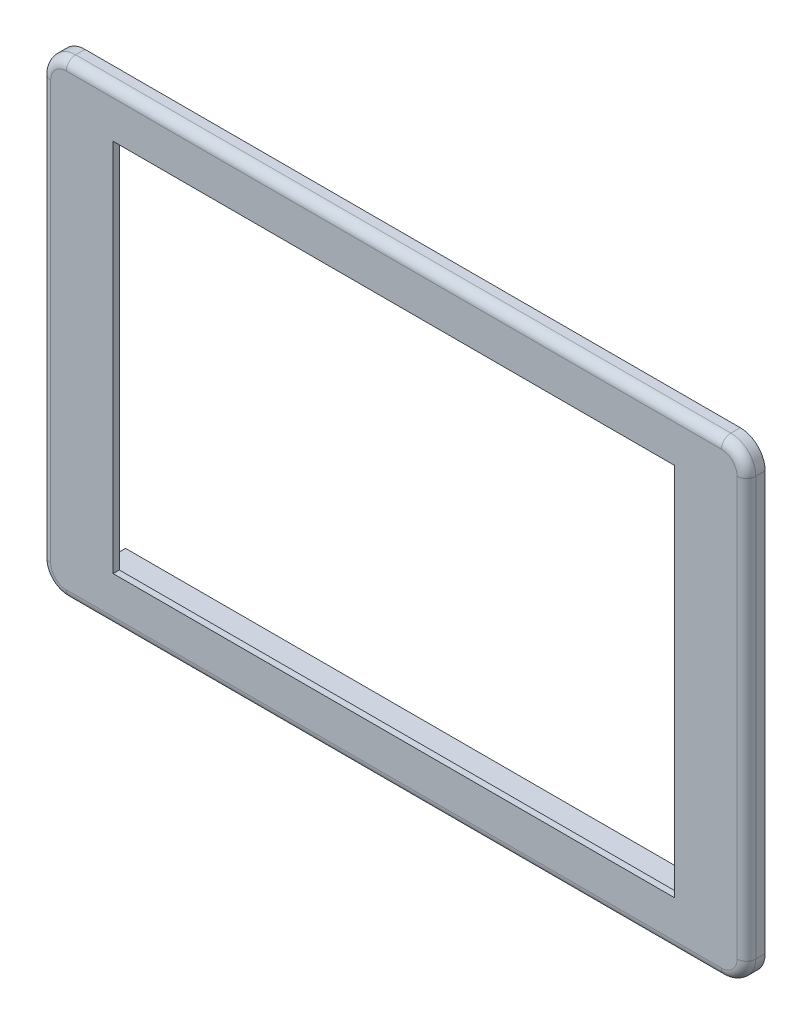
ISO-10303-21;
HEADER;
FILE_DESCRIPTION(('STEP AP214'),'2;1');
FILE_NAME('part.step','',(''),(''),'','','');
FILE_SCHEMA(('AUTOMOTIVE_DESIGN { 1 0 10303 214 1 1 1 1 }'));
ENDSEC;
DATA;
#1=APPLICATION_CONTEXT('core data for automotive mechanical design processes');
#2=APPLICATION_PROTOCOL_DEFINITION('international standard','automotive_design',2000,#1);
#3=PRODUCT_CONTEXT('',#1,'mechanical');
#4=PRODUCT('Part','Part','',(#3));
#5=PRODUCT_RELATED_PRODUCT_CATEGORY('part','',(#4));
#6=PRODUCT_DEFINITION_FORMATION('','',#4);
#7=PRODUCT_DEFINITION_CONTEXT('part definition',#1,'design');
#8=PRODUCT_DEFINITION('design','',#6,#7);
#9=PRODUCT_DEFINITION_SHAPE('','',#8);
#10=(LENGTH_UNIT() NAMED_UNIT(*) SI_UNIT(.MILLI.,.METRE.));
#11=(NAMED_UNIT(*) PLANE_ANGLE_UNIT() SI_UNIT($,.RADIAN.));
#12=(NAMED_UNIT(*) SI_UNIT($,.STERADIAN.) SOLID_ANGLE_UNIT());
#13=UNCERTAINTY_MEASURE_WITH_UNIT(LENGTH_MEASURE(1.E-05),#10,'distance_accuracy_value','');
#14=(GEOMETRIC_REPRESENTATION_CONTEXT(3) GLOBAL_UNCERTAINTY_ASSIGNED_CONTEXT((#13)) GLOBAL_UNIT_ASSIGNED_CONTEXT((#10,
#11,#12)) REPRESENTATION_CONTEXT('',''));
#15=CARTESIAN_POINT('',(0.,0.,0.));
#16=DIRECTION('',(0.,0.,1.));
#17=DIRECTION('',(1.,0.,0.));
#18=AXIS2_PLACEMENT_3D('',#15,#16,#17);
#19=CARTESIAN_POINT('',(-75.0209507435224,34.8430782656183,3.));
#20=DIRECTION('',(1.,0.,0.));
#21=DIRECTION('',(0.,1.,0.));
#22=AXIS2_PLACEMENT_3D('',#19,#20,#21);
#23=PLANE('',#22);
#24=DIRECTION('',(0.,0.,-1.));
#25=VECTOR('',#24,1.);
#26=CARTESIAN_POINT('',(-75.0209507435224,34.8430782656183,3.));
#27=LINE('',#26,#25);
#28=CARTESIAN_POINT('',(-75.0209507435224,34.8430782656183,2.));
#29=VERTEX_POINT('',#28);
#30=CARTESIAN_POINT('',(-75.0209507435224,34.8430782656183,0.));
#31=VERTEX_POINT('',#30);
#32=EDGE_CURVE('E256',#29,#31,#27,.T.);
#33=ORIENTED_EDGE('',*,*,#32,.F.);
#34=DIRECTION('',(0.,-1.,0.));
#35=VECTOR('',#34,1.);
#36=CARTESIAN_POINT('',(-75.0209507435224,34.8430782656183,2.));
#37=LINE('',#36,#35);
#38=CARTESIAN_POINT('',(-75.0209507435224,-28.1569217343817,2.));
#39=VERTEX_POINT('',#38);
#40=EDGE_CURVE('E63',#29,#39,#37,.T.);
#41=ORIENTED_EDGE('',*,*,#40,.T.);
#42=DIRECTION('',(0.,0.,-1.));
#43=VECTOR('',#42,1.);
#44=CARTESIAN_POINT('',(-75.0209507435224,-28.1569217343817,3.));
#45=LINE('',#44,#43);
#46=CARTESIAN_POINT('',(-75.0209507435224,-28.1569217343817,0.));
#47=VERTEX_POINT('',#46);
#48=EDGE_CURVE('E265',#39,#47,#45,.T.);
#49=ORIENTED_EDGE('',*,*,#48,.T.);
#50=DIRECTION('',(0.,-1.,0.));
#51=VECTOR('',#50,1.);
#52=CARTESIAN_POINT('',(-75.0209507435224,34.8430782656183,0.));
#53=LINE('',#52,#51);
#54=EDGE_CURVE('E242',#31,#47,#53,.T.);
#55=ORIENTED_EDGE('',*,*,#54,.F.);
#56=EDGE_LOOP('',(#33,#41,#49,#55));
#57=FACE_BOUND('',#56,.T.);
#58=ADVANCED_FACE('F45',(#57),#23,.T.);
#59=CARTESIAN_POINT('',(-75.0209507435224,-28.1569217343817,3.));
#60=DIRECTION('',(0.,1.,0.));
#61=DIRECTION('',(0.,0.,1.));
#62=AXIS2_PLACEMENT_3D('',#59,#60,#61);
#63=PLANE('',#62);
#64=ORIENTED_EDGE('',*,*,#48,.F.);
#65=DIRECTION('',(1.,0.,0.));
#66=VECTOR('',#65,1.);
#67=CARTESIAN_POINT('',(-75.0209507435224,-28.1569217343817,2.));
#68=LINE('',#67,#66);
#69=CARTESIAN_POINT('',(22.9790492564776,-28.1569217343817,2.));
#70=VERTEX_POINT('',#69);
#71=EDGE_CURVE('E486',#39,#70,#68,.T.);
#72=ORIENTED_EDGE('',*,*,#71,.T.);
#73=DIRECTION('',(0.,0.,-1.));
#74=VECTOR('',#73,1.);
#75=CARTESIAN_POINT('',(22.9790492564776,-28.1569217343817,3.));
#76=LINE('',#75,#74);
#77=CARTESIAN_POINT('',(22.9790492564776,-28.1569217343817,0.));
#78=VERTEX_POINT('',#77);
#79=EDGE_CURVE('E262',#70,#78,#76,.T.);
#80=ORIENTED_EDGE('',*,*,#79,.T.);
#81=DIRECTION('',(0.,0.,1.));
#82=VECTOR('',#81,1.);
#83=CARTESIAN_POINT('',(22.9790492564776,-28.1569217343817,-3.));
#84=LINE('',#83,#82);
#85=CARTESIAN_POINT('',(22.9790492564776,-28.1569217343817,-3.));
#86=VERTEX_POINT('',#85);
#87=EDGE_CURVE('E424',#86,#78,#84,.T.);
#88=ORIENTED_EDGE('',*,*,#87,.F.);
#89=DIRECTION('',(1.,0.,0.));
#90=VECTOR('',#89,1.);
#91=CARTESIAN_POINT('',(22.9790492564776,-28.1569217343817,-3.));
#92=LINE('',#91,#90);
#93=CARTESIAN_POINT('',(-75.0209507435224,-28.1569217343817,-3.));
#94=VERTEX_POINT('',#93);
#95=EDGE_CURVE('E428',#94,#86,#92,.T.);
#96=ORIENTED_EDGE('',*,*,#95,.F.);
#97=DIRECTION('',(0.,0.,1.));
#98=VECTOR('',#97,1.);
#99=CARTESIAN_POINT('',(-75.0209507435224,-28.1569217343817,-3.));
#100=LINE('',#99,#98);
#101=EDGE_CURVE('E416',#94,#47,#100,.T.);
#102=ORIENTED_EDGE('',*,*,#101,.T.);
#103=EDGE_LOOP('',(#64,#72,#80,#88,#96,#102));
#104=FACE_BOUND('',#103,.T.);
#105=ADVANCED_FACE('F509',(#104),#63,.T.);
#106=CARTESIAN_POINT('',(22.9790492564776,34.8430782656183,3.));
#107=DIRECTION('',(-1.,0.,0.));
#108=DIRECTION('',(0.,-1.,0.));
#109=AXIS2_PLACEMENT_3D('',#106,#107,#108);
#110=PLANE('',#109);
#111=ORIENTED_EDGE('',*,*,#79,.F.);
#112=DIRECTION('',(0.,1.,0.));
#113=VECTOR('',#112,1.);
#114=CARTESIAN_POINT('',(22.9790492564776,34.8430782656183,2.));
#115=LINE('',#114,#113);
#116=CARTESIAN_POINT('',(22.9790492564776,34.8430782656183,2.));
#117=VERTEX_POINT('',#116);
#118=EDGE_CURVE('E489',#70,#117,#115,.T.);
#119=ORIENTED_EDGE('',*,*,#118,.T.);
#120=DIRECTION('',(0.,0.,-1.));
#121=VECTOR('',#120,1.);
#122=CARTESIAN_POINT('',(22.9790492564776,34.8430782656183,3.));
#123=LINE('',#122,#121);
#124=CARTESIAN_POINT('',(22.9790492564776,34.8430782656183,0.));
#125=VERTEX_POINT('',#124);
#126=EDGE_CURVE('E259',#117,#125,#123,.T.);
#127=ORIENTED_EDGE('',*,*,#126,.T.);
#128=DIRECTION('',(0.,1.,0.));
#129=VECTOR('',#128,1.);
#130=CARTESIAN_POINT('',(22.9790492564776,34.8430782656183,0.));
#131=LINE('',#130,#129);
#132=EDGE_CURVE('E247',#78,#125,#131,.T.);
#133=ORIENTED_EDGE('',*,*,#132,.F.);
#134=EDGE_LOOP('',(#111,#119,#127,#133));
#135=FACE_BOUND('',#134,.T.);
#136=ADVANCED_FACE('F533',(#135),#110,.T.);
#137=CARTESIAN_POINT('',(-75.0209507435224,34.8430782656183,3.));
#138=DIRECTION('',(0.,-1.,0.));
#139=DIRECTION('',(0.,0.,-1.));
#140=AXIS2_PLACEMENT_3D('',#137,#138,#139);
#141=PLANE('',#140);
#142=DIRECTION('',(-1.,0.,0.));
#143=VECTOR('',#142,1.);
#144=CARTESIAN_POINT('',(30.4790492564776,34.8430782656183,-2.49999999999996));
#145=LINE('',#144,#143);
#146=CARTESIAN_POINT('',(22.9790492564776,34.8430782656183,-2.49999999999996));
#147=VERTEX_POINT('',#146);
#148=CARTESIAN_POINT('',(-75.0209507435224,34.8430782656183,-2.49999999999996));
#149=VERTEX_POINT('',#148);
#150=EDGE_CURVE('E217',#147,#149,#145,.T.);
#151=ORIENTED_EDGE('',*,*,#150,.F.);
#152=DIRECTION('',(0.,0.,1.));
#153=VECTOR('',#152,1.);
#154=CARTESIAN_POINT('',(22.9790492564776,34.8430782656183,-3.));
#155=LINE('',#154,#153);
#156=EDGE_CURVE('E233',#147,#125,#155,.T.);
#157=ORIENTED_EDGE('',*,*,#156,.T.);
#158=ORIENTED_EDGE('',*,*,#126,.F.);
#159=DIRECTION('',(-1.,0.,0.));
#160=VECTOR('',#159,1.);
#161=CARTESIAN_POINT('',(-75.0209507435224,34.8430782656183,2.));
#162=LINE('',#161,#160);
#163=EDGE_CURVE('E372',#117,#29,#162,.T.);
#164=ORIENTED_EDGE('',*,*,#163,.T.);
#165=ORIENTED_EDGE('',*,*,#32,.T.);
#166=DIRECTION('',(0.,0.,1.));
#167=VECTOR('',#166,1.);
#168=CARTESIAN_POINT('',(-75.0209507435224,34.8430782656183,-3.));
#169=LINE('',#168,#167);
#170=EDGE_CURVE('E236',#149,#31,#169,.T.);
#171=ORIENTED_EDGE('',*,*,#170,.F.);
#172=EDGE_LOOP('',(#151,#157,#158,#164,#165,#171));
#173=FACE_BOUND('',#172,.T.);
#174=ADVANCED_FACE('F231',(#173),#141,.T.);
#175=CARTESIAN_POINT('',(0.,0.,0.));
#176=DIRECTION('',(0.,0.,1.));
#177=DIRECTION('',(1.,0.,0.));
#178=AXIS2_PLACEMENT_3D('',#175,#176,#177);
#179=PLANE('',#178);
#180=DIRECTION('',(1.,0.,0.));
#181=VECTOR('',#180,1.);
#182=CARTESIAN_POINT('',(22.9790492564776,37.3430782656183,0.));
#183=LINE('',#182,#181);
#184=CARTESIAN_POINT('',(-75.0209507435224,37.3430782656183,0.));
#185=VERTEX_POINT('',#184);
#186=CARTESIAN_POINT('',(22.9790492564776,37.3430782656183,0.));
#187=VERTEX_POINT('',#186);
#188=EDGE_CURVE('E220',#185,#187,#183,.T.);
#189=ORIENTED_EDGE('',*,*,#188,.F.);
#190=DIRECTION('',(0.,1.,0.));
#191=VECTOR('',#190,1.);
#192=CARTESIAN_POINT('',(-75.0209507435224,34.8430782656183,0.));
#193=LINE('',#192,#191);
#194=EDGE_CURVE('E452',#31,#185,#193,.T.);
#195=ORIENTED_EDGE('',*,*,#194,.F.);
#196=ORIENTED_EDGE('',*,*,#54,.T.);
#197=DIRECTION('',(0.,1.,0.));
#198=VECTOR('',#197,1.);
#199=CARTESIAN_POINT('',(-75.0209507435224,-28.1569217343817,0.));
#200=LINE('',#199,#198);
#201=CARTESIAN_POINT('',(-75.0209507435224,-30.6569217343817,0.));
#202=VERTEX_POINT('',#201);
#203=EDGE_CURVE('E429',#202,#47,#200,.T.);
#204=ORIENTED_EDGE('',*,*,#203,.F.);
#205=DIRECTION('',(-1.,0.,0.));
#206=VECTOR('',#205,1.);
#207=CARTESIAN_POINT('',(22.9790492564776,-30.6569217343817,0.));
#208=LINE('',#207,#206);
#209=CARTESIAN_POINT('',(22.9790492564776,-30.6569217343817,0.));
#210=VERTEX_POINT('',#209);
#211=EDGE_CURVE('E433',#210,#202,#208,.T.);
#212=ORIENTED_EDGE('',*,*,#211,.F.);
#213=DIRECTION('',(0.,-1.,0.));
#214=VECTOR('',#213,1.);
#215=CARTESIAN_POINT('',(22.9790492564776,-28.1569217343817,0.));
#216=LINE('',#215,#214);
#217=EDGE_CURVE('E437',#78,#210,#216,.T.);
#218=ORIENTED_EDGE('',*,*,#217,.F.);
#219=ORIENTED_EDGE('',*,*,#132,.T.);
#220=DIRECTION('',(0.,-1.,0.));
#221=VECTOR('',#220,1.);
#222=CARTESIAN_POINT('',(22.9790492564776,34.8430782656183,0.));
#223=LINE('',#222,#221);
#224=EDGE_CURVE('E240',#187,#125,#223,.T.);
#225=ORIENTED_EDGE('',*,*,#224,.F.);
#226=EDGE_LOOP('',(#189,#195,#196,#204,#212,#218,#219,#225));
#227=FACE_BOUND('',#226,.T.);
#228=CARTESIAN_POINT('',(-78.5209507435224,36.8430782656183,0.));
#229=DIRECTION('',(0.,0.,1.));
#230=DIRECTION('',(1.,0.,0.));
#231=AXIS2_PLACEMENT_3D('',#228,#229,#230);
#232=CIRCLE('',#231,4.);
#233=CARTESIAN_POINT('',(-82.5209507435224,36.8430782656183,0.));
#234=VERTEX_POINT('',#233);
#235=CARTESIAN_POINT('',(-78.5209507435224,40.8430782656183,0.));
#236=VERTEX_POINT('',#235);
#237=EDGE_CURVE('E300',#234,#236,#232,.F.);
#238=ORIENTED_EDGE('',*,*,#237,.T.);
#239=DIRECTION('',(-1.,0.,0.));
#240=VECTOR('',#239,1.);
#241=CARTESIAN_POINT('',(-82.5209507435224,40.8430782656183,0.));
#242=LINE('',#241,#240);
#243=CARTESIAN_POINT('',(26.4790492564776,40.8430782656183,0.));
#244=VERTEX_POINT('',#243);
#245=EDGE_CURVE('E280',#244,#236,#242,.T.);
#246=ORIENTED_EDGE('',*,*,#245,.F.);
#247=CARTESIAN_POINT('',(26.4790492564776,36.8430782656183,0.));
#248=DIRECTION('',(0.,0.,1.));
#249=DIRECTION('',(1.,0.,0.));
#250=AXIS2_PLACEMENT_3D('',#247,#248,#249);
#251=CIRCLE('',#250,4.);
#252=CARTESIAN_POINT('',(30.4790492564775,36.8430782656183,0.));
#253=VERTEX_POINT('',#252);
#254=EDGE_CURVE('E291',#244,#253,#251,.F.);
#255=ORIENTED_EDGE('',*,*,#254,.T.);
#256=DIRECTION('',(0.,1.,0.));
#257=VECTOR('',#256,1.);
#258=CARTESIAN_POINT('',(30.4790492564775,40.8430782656183,0.));
#259=LINE('',#258,#257);
#260=CARTESIAN_POINT('',(30.4790492564776,-30.1569217343817,0.));
#261=VERTEX_POINT('',#260);
#262=EDGE_CURVE('E276',#261,#253,#259,.T.);
#263=ORIENTED_EDGE('',*,*,#262,.F.);
#264=CARTESIAN_POINT('',(26.4790492564776,-30.1569217343817,0.));
#265=DIRECTION('',(0.,0.,1.));
#266=DIRECTION('',(1.,0.,0.));
#267=AXIS2_PLACEMENT_3D('',#264,#265,#266);
#268=CIRCLE('',#267,4.);
#269=CARTESIAN_POINT('',(26.4790492564776,-34.1569217343817,0.));
#270=VERTEX_POINT('',#269);
#271=EDGE_CURVE('E294',#261,#270,#268,.F.);
#272=ORIENTED_EDGE('',*,*,#271,.T.);
#273=DIRECTION('',(1.,0.,0.));
#274=VECTOR('',#273,1.);
#275=CARTESIAN_POINT('',(-82.5209507435224,-34.1569217343817,0.));
#276=LINE('',#275,#274);
#277=CARTESIAN_POINT('',(-78.5209507435224,-34.1569217343817,0.));
#278=VERTEX_POINT('',#277);
#279=EDGE_CURVE('E272',#278,#270,#276,.T.);
#280=ORIENTED_EDGE('',*,*,#279,.F.);
#281=CARTESIAN_POINT('',(-78.5209507435224,-30.1569217343817,0.));
#282=DIRECTION('',(0.,0.,1.));
#283=DIRECTION('',(1.,0.,0.));
#284=AXIS2_PLACEMENT_3D('',#281,#282,#283);
#285=CIRCLE('',#284,4.);
#286=CARTESIAN_POINT('',(-82.5209507435224,-30.1569217343817,0.));
#287=VERTEX_POINT('',#286);
#288=EDGE_CURVE('E297',#278,#287,#285,.F.);
#289=ORIENTED_EDGE('',*,*,#288,.T.);
#290=DIRECTION('',(0.,-1.,0.));
#291=VECTOR('',#290,1.);
#292=CARTESIAN_POINT('',(-82.5209507435224,40.8430782656183,0.));
#293=LINE('',#292,#291);
#294=EDGE_CURVE('E268',#234,#287,#293,.T.);
#295=ORIENTED_EDGE('',*,*,#294,.F.);
#296=EDGE_LOOP('',(#238,#246,#255,#263,#272,#280,#289,#295));
#297=FACE_BOUND('',#296,.T.);
#298=ADVANCED_FACE('F500',(#227,#297),#179,.F.);
#299=CARTESIAN_POINT('',(0.,0.,3.));
#300=DIRECTION('',(0.,0.,1.));
#301=DIRECTION('',(1.,0.,0.));
#302=AXIS2_PLACEMENT_3D('',#299,#300,#301);
#303=PLANE('',#302);
#304=CARTESIAN_POINT('',(26.4790492564776,36.8430782656183,3.));
#305=DIRECTION('',(0.,0.,1.));
#306=DIRECTION('',(1.,0.,0.));
#307=AXIS2_PLACEMENT_3D('',#304,#305,#306);
#308=CIRCLE('',#307,2.5);
#309=CARTESIAN_POINT('',(28.9790492564776,36.8430782656183,3.));
#310=VERTEX_POINT('',#309);
#311=CARTESIAN_POINT('',(26.4790492564776,39.3430782656183,3.));
#312=VERTEX_POINT('',#311);
#313=EDGE_CURVE('E339',#310,#312,#308,.T.);
#314=ORIENTED_EDGE('',*,*,#313,.T.);
#315=DIRECTION('',(-1.,0.,0.));
#316=VECTOR('',#315,1.);
#317=CARTESIAN_POINT('',(-78.5209507435224,39.3430782656183,3.));
#318=LINE('',#317,#316);
#319=CARTESIAN_POINT('',(-78.5209507435224,39.3430782656183,3.));
#320=VERTEX_POINT('',#319);
#321=EDGE_CURVE('E345',#312,#320,#318,.T.);
#322=ORIENTED_EDGE('',*,*,#321,.T.);
#323=CARTESIAN_POINT('',(-78.5209507435224,36.8430782656183,3.));
#324=DIRECTION('',(0.,0.,1.));
#325=DIRECTION('',(1.,0.,0.));
#326=AXIS2_PLACEMENT_3D('',#323,#324,#325);
#327=CIRCLE('',#326,2.5);
#328=CARTESIAN_POINT('',(-81.0209507435224,36.8430782656183,3.));
#329=VERTEX_POINT('',#328);
#330=EDGE_CURVE('E342',#320,#329,#327,.T.);
#331=ORIENTED_EDGE('',*,*,#330,.T.);
#332=DIRECTION('',(0.,-1.,0.));
#333=VECTOR('',#332,1.);
#334=CARTESIAN_POINT('',(-81.0209507435224,-30.1569217343817,3.));
#335=LINE('',#334,#333);
#336=CARTESIAN_POINT('',(-81.0209507435224,-30.1569217343817,3.));
#337=VERTEX_POINT('',#336);
#338=EDGE_CURVE('E333',#329,#337,#335,.T.);
#339=ORIENTED_EDGE('',*,*,#338,.T.);
#340=CARTESIAN_POINT('',(-78.5209507435224,-30.1569217343817,3.));
#341=DIRECTION('',(0.,0.,1.));
#342=DIRECTION('',(1.,0.,0.));
#343=AXIS2_PLACEMENT_3D('',#340,#341,#342);
#344=CIRCLE('',#343,2.5);
#345=CARTESIAN_POINT('',(-78.5209507435224,-32.6569217343817,3.));
#346=VERTEX_POINT('',#345);
#347=EDGE_CURVE('E329',#337,#346,#344,.T.);
#348=ORIENTED_EDGE('',*,*,#347,.T.);
#349=DIRECTION('',(1.,0.,0.));
#350=VECTOR('',#349,1.);
#351=CARTESIAN_POINT('',(26.4790492564776,-32.6569217343817,3.));
#352=LINE('',#351,#350);
#353=CARTESIAN_POINT('',(26.4790492564776,-32.6569217343817,3.));
#354=VERTEX_POINT('',#353);
#355=EDGE_CURVE('E323',#346,#354,#352,.T.);
#356=ORIENTED_EDGE('',*,*,#355,.T.);
#357=CARTESIAN_POINT('',(26.4790492564776,-30.1569217343817,3.));
#358=DIRECTION('',(0.,0.,1.));
#359=DIRECTION('',(1.,0.,0.));
#360=AXIS2_PLACEMENT_3D('',#357,#358,#359);
#361=CIRCLE('',#360,2.5);
#362=CARTESIAN_POINT('',(28.9790492564776,-30.1569217343817,3.));
#363=VERTEX_POINT('',#362);
#364=EDGE_CURVE('E326',#354,#363,#361,.T.);
#365=ORIENTED_EDGE('',*,*,#364,.T.);
#366=DIRECTION('',(0.,1.,0.));
#367=VECTOR('',#366,1.);
#368=CARTESIAN_POINT('',(28.9790492564776,36.8430782656183,3.));
#369=LINE('',#368,#367);
#370=EDGE_CURVE('E336',#363,#310,#369,.T.);
#371=ORIENTED_EDGE('',*,*,#370,.T.);
#372=EDGE_LOOP('',(#314,#322,#331,#339,#348,#356,#365,#371));
#373=FACE_BOUND('',#372,.T.);
#374=DIRECTION('',(0.,-1.,0.));
#375=VECTOR('',#374,1.);
#376=CARTESIAN_POINT('',(-71.0209507435224,33.3430782656183,3.));
#377=LINE('',#376,#375);
#378=CARTESIAN_POINT('',(-71.0209507435224,33.3430782656183,3.));
#379=VERTEX_POINT('',#378);
#380=CARTESIAN_POINT('',(-71.0209507435224,-26.6569217343817,3.));
#381=VERTEX_POINT('',#380);
#382=EDGE_CURVE('E226',#379,#381,#377,.T.);
#383=ORIENTED_EDGE('',*,*,#382,.F.);
#384=DIRECTION('',(-1.,0.,0.));
#385=VECTOR('',#384,1.);
#386=CARTESIAN_POINT('',(-71.0209507435224,33.3430782656183,3.));
#387=LINE('',#386,#385);
#388=CARTESIAN_POINT('',(18.9790492564776,33.3430782656183,3.));
#389=VERTEX_POINT('',#388);
#390=EDGE_CURVE('E469',#389,#379,#387,.T.);
#391=ORIENTED_EDGE('',*,*,#390,.F.);
#392=DIRECTION('',(0.,1.,0.));
#393=VECTOR('',#392,1.);
#394=CARTESIAN_POINT('',(18.9790492564776,33.3430782656183,3.));
#395=LINE('',#394,#393);
#396=CARTESIAN_POINT('',(18.9790492564776,-26.6569217343817,3.));
#397=VERTEX_POINT('',#396);
#398=EDGE_CURVE('E467',#397,#389,#395,.T.);
#399=ORIENTED_EDGE('',*,*,#398,.F.);
#400=DIRECTION('',(1.,0.,0.));
#401=VECTOR('',#400,1.);
#402=CARTESIAN_POINT('',(-71.0209507435224,-26.6569217343817,3.));
#403=LINE('',#402,#401);
#404=EDGE_CURVE('E470',#381,#397,#403,.T.);
#405=ORIENTED_EDGE('',*,*,#404,.F.);
#406=EDGE_LOOP('',(#383,#391,#399,#405));
#407=FACE_BOUND('',#406,.T.);
#408=ADVANCED_FACE('F537',(#373,#407),#303,.T.);
#409=CARTESIAN_POINT('',(-82.5209507435224,40.8430782656183,3.));
#410=DIRECTION('',(1.,0.,0.));
#411=DIRECTION('',(0.,0.,-1.));
#412=AXIS2_PLACEMENT_3D('',#409,#410,#411);
#413=PLANE('',#412);
#414=DIRECTION('',(0.,0.,-1.));
#415=VECTOR('',#414,1.);
#416=CARTESIAN_POINT('',(-82.5209507435224,-30.1569217343817,3.));
#417=LINE('',#416,#415);
#418=CARTESIAN_POINT('',(-82.5209507435224,-30.1569217343817,1.5));
#419=VERTEX_POINT('',#418);
#420=EDGE_CURVE('E284',#287,#419,#417,.F.);
#421=ORIENTED_EDGE('',*,*,#420,.T.);
#422=DIRECTION('',(0.,-1.,0.));
#423=VECTOR('',#422,1.);
#424=CARTESIAN_POINT('',(-82.5209507435224,36.8430782656183,1.5));
#425=LINE('',#424,#423);
#426=CARTESIAN_POINT('',(-82.5209507435224,36.8430782656183,1.5));
#427=VERTEX_POINT('',#426);
#428=EDGE_CURVE('E55',#419,#427,#425,.F.);
#429=ORIENTED_EDGE('',*,*,#428,.T.);
#430=DIRECTION('',(0.,0.,-1.));
#431=VECTOR('',#430,1.);
#432=CARTESIAN_POINT('',(-82.5209507435224,36.8430782656183,3.));
#433=LINE('',#432,#431);
#434=EDGE_CURVE('E288',#427,#234,#433,.T.);
#435=ORIENTED_EDGE('',*,*,#434,.T.);
#436=ORIENTED_EDGE('',*,*,#294,.T.);
#437=EDGE_LOOP('',(#421,#429,#435,#436));
#438=FACE_BOUND('',#437,.T.);
#439=ADVANCED_FACE('F540',(#438),#413,.F.);
#440=CARTESIAN_POINT('',(-82.5209507435224,-34.1569217343817,3.));
#441=DIRECTION('',(0.,1.,0.));
#442=DIRECTION('',(-1.,0.,0.));
#443=AXIS2_PLACEMENT_3D('',#440,#441,#442);
#444=PLANE('',#443);
#445=DIRECTION('',(0.,0.,-1.));
#446=VECTOR('',#445,1.);
#447=CARTESIAN_POINT('',(26.4790492564776,-34.1569217343817,3.));
#448=LINE('',#447,#446);
#449=CARTESIAN_POINT('',(26.4790492564776,-34.1569217343817,1.5));
#450=VERTEX_POINT('',#449);
#451=EDGE_CURVE('E310',#270,#450,#448,.F.);
#452=ORIENTED_EDGE('',*,*,#451,.T.);
#453=DIRECTION('',(1.,0.,0.));
#454=VECTOR('',#453,1.);
#455=CARTESIAN_POINT('',(-78.5209507435224,-34.1569217343817,1.5));
#456=LINE('',#455,#454);
#457=CARTESIAN_POINT('',(-78.5209507435224,-34.1569217343817,1.5));
#458=VERTEX_POINT('',#457);
#459=EDGE_CURVE('E11',#450,#458,#456,.F.);
#460=ORIENTED_EDGE('',*,*,#459,.T.);
#461=DIRECTION('',(0.,0.,-1.));
#462=VECTOR('',#461,1.);
#463=CARTESIAN_POINT('',(-78.5209507435224,-34.1569217343817,3.));
#464=LINE('',#463,#462);
#465=EDGE_CURVE('E314',#458,#278,#464,.T.);
#466=ORIENTED_EDGE('',*,*,#465,.T.);
#467=ORIENTED_EDGE('',*,*,#279,.T.);
#468=EDGE_LOOP('',(#452,#460,#466,#467));
#469=FACE_BOUND('',#468,.T.);
#470=ADVANCED_FACE('F552',(#469),#444,.F.);
#471=CARTESIAN_POINT('',(30.4790492564775,40.8430782656183,3.));
#472=DIRECTION('',(-1.,0.,0.));
#473=DIRECTION('',(0.,-1.,0.));
#474=AXIS2_PLACEMENT_3D('',#471,#472,#473);
#475=PLANE('',#474);
#476=DIRECTION('',(0.,0.,-1.));
#477=VECTOR('',#476,1.);
#478=CARTESIAN_POINT('',(30.4790492564775,36.8430782656183,3.));
#479=LINE('',#478,#477);
#480=CARTESIAN_POINT('',(30.4790492564775,36.8430782656183,1.5));
#481=VERTEX_POINT('',#480);
#482=EDGE_CURVE('E317',#253,#481,#479,.F.);
#483=ORIENTED_EDGE('',*,*,#482,.T.);
#484=DIRECTION('',(0.,1.,0.));
#485=VECTOR('',#484,1.);
#486=CARTESIAN_POINT('',(30.4790492564776,-30.1569217343817,1.5));
#487=LINE('',#486,#485);
#488=CARTESIAN_POINT('',(30.4790492564776,-30.1569217343817,1.5));
#489=VERTEX_POINT('',#488);
#490=EDGE_CURVE('E71',#481,#489,#487,.F.);
#491=ORIENTED_EDGE('',*,*,#490,.T.);
#492=DIRECTION('',(0.,0.,-1.));
#493=VECTOR('',#492,1.);
#494=CARTESIAN_POINT('',(30.4790492564776,-30.1569217343817,3.));
#495=LINE('',#494,#493);
#496=EDGE_CURVE('E320',#489,#261,#495,.T.);
#497=ORIENTED_EDGE('',*,*,#496,.T.);
#498=ORIENTED_EDGE('',*,*,#262,.T.);
#499=EDGE_LOOP('',(#483,#491,#497,#498));
#500=FACE_BOUND('',#499,.T.);
#501=ADVANCED_FACE('F548',(#500),#475,.F.);
#502=CARTESIAN_POINT('',(-82.5209507435224,40.8430782656183,3.));
#503=DIRECTION('',(0.,-1.,0.));
#504=DIRECTION('',(1.,0.,0.));
#505=AXIS2_PLACEMENT_3D('',#502,#503,#504);
#506=PLANE('',#505);
#507=DIRECTION('',(0.,0.,-1.));
#508=VECTOR('',#507,1.);
#509=CARTESIAN_POINT('',(-78.5209507435224,40.8430782656183,3.));
#510=LINE('',#509,#508);
#511=CARTESIAN_POINT('',(-78.5209507435224,40.8430782656183,1.5));
#512=VERTEX_POINT('',#511);
#513=EDGE_CURVE('E306',#236,#512,#510,.F.);
#514=ORIENTED_EDGE('',*,*,#513,.T.);
#515=DIRECTION('',(-1.,0.,0.));
#516=VECTOR('',#515,1.);
#517=CARTESIAN_POINT('',(26.4790492564776,40.8430782656183,1.5));
#518=LINE('',#517,#516);
#519=CARTESIAN_POINT('',(26.4790492564776,40.8430782656183,1.5));
#520=VERTEX_POINT('',#519);
#521=EDGE_CURVE('E363',#512,#520,#518,.F.);
#522=ORIENTED_EDGE('',*,*,#521,.T.);
#523=DIRECTION('',(0.,0.,-1.));
#524=VECTOR('',#523,1.);
#525=CARTESIAN_POINT('',(26.4790492564776,40.8430782656183,3.));
#526=LINE('',#525,#524);
#527=EDGE_CURVE('E303',#520,#244,#526,.T.);
#528=ORIENTED_EDGE('',*,*,#527,.T.);
#529=ORIENTED_EDGE('',*,*,#245,.T.);
#530=EDGE_LOOP('',(#514,#522,#528,#529));
#531=FACE_BOUND('',#530,.T.);
#532=ADVANCED_FACE('F544',(#531),#506,.F.);
#533=CARTESIAN_POINT('',(-78.5209507435224,36.8430782656183,3.));
#534=DIRECTION('',(0.,0.,-1.));
#535=DIRECTION('',(-1.,0.,0.));
#536=AXIS2_PLACEMENT_3D('',#533,#534,#535);
#537=CYLINDRICAL_SURFACE('',#536,4.);
#538=ORIENTED_EDGE('',*,*,#434,.F.);
#539=CARTESIAN_POINT('',(-78.5209507435224,36.8430782656183,1.5));
#540=DIRECTION('',(0.,0.,1.));
#541=DIRECTION('',(1.,0.,0.));
#542=AXIS2_PLACEMENT_3D('',#539,#540,#541);
#543=CIRCLE('',#542,4.);
#544=EDGE_CURVE('E352',#427,#512,#543,.F.);
#545=ORIENTED_EDGE('',*,*,#544,.T.);
#546=ORIENTED_EDGE('',*,*,#513,.F.);
#547=ORIENTED_EDGE('',*,*,#237,.F.);
#548=EDGE_LOOP('',(#538,#545,#546,#547));
#549=FACE_BOUND('',#548,.T.);
#550=ADVANCED_FACE('F547',(#549),#537,.T.);
#551=CARTESIAN_POINT('',(-78.5209507435224,-30.1569217343817,3.));
#552=DIRECTION('',(0.,0.,-1.));
#553=DIRECTION('',(-1.,0.,0.));
#554=AXIS2_PLACEMENT_3D('',#551,#552,#553);
#555=CYLINDRICAL_SURFACE('',#554,4.);
#556=ORIENTED_EDGE('',*,*,#465,.F.);
#557=CARTESIAN_POINT('',(-78.5209507435224,-30.1569217343817,1.5));
#558=DIRECTION('',(0.,0.,1.));
#559=DIRECTION('',(1.,0.,0.));
#560=AXIS2_PLACEMENT_3D('',#557,#558,#559);
#561=CIRCLE('',#560,4.);
#562=EDGE_CURVE('E348',#458,#419,#561,.F.);
#563=ORIENTED_EDGE('',*,*,#562,.T.);
#564=ORIENTED_EDGE('',*,*,#420,.F.);
#565=ORIENTED_EDGE('',*,*,#288,.F.);
#566=EDGE_LOOP('',(#556,#563,#564,#565));
#567=FACE_BOUND('',#566,.T.);
#568=ADVANCED_FACE('F561',(#567),#555,.T.);
#569=CARTESIAN_POINT('',(26.4790492564776,-30.1569217343817,3.));
#570=DIRECTION('',(0.,0.,-1.));
#571=DIRECTION('',(-1.,0.,0.));
#572=AXIS2_PLACEMENT_3D('',#569,#570,#571);
#573=CYLINDRICAL_SURFACE('',#572,4.);
#574=ORIENTED_EDGE('',*,*,#496,.F.);
#575=CARTESIAN_POINT('',(26.4790492564776,-30.1569217343817,1.5));
#576=DIRECTION('',(0.,0.,1.));
#577=DIRECTION('',(1.,0.,0.));
#578=AXIS2_PLACEMENT_3D('',#575,#576,#577);
#579=CIRCLE('',#578,4.);
#580=EDGE_CURVE('E358',#489,#450,#579,.F.);
#581=ORIENTED_EDGE('',*,*,#580,.T.);
#582=ORIENTED_EDGE('',*,*,#451,.F.);
#583=ORIENTED_EDGE('',*,*,#271,.F.);
#584=EDGE_LOOP('',(#574,#581,#582,#583));
#585=FACE_BOUND('',#584,.T.);
#586=ADVANCED_FACE('F565',(#585),#573,.T.);
#587=CARTESIAN_POINT('',(26.4790492564776,36.8430782656183,3.));
#588=DIRECTION('',(0.,0.,-1.));
#589=DIRECTION('',(-1.,0.,0.));
#590=AXIS2_PLACEMENT_3D('',#587,#588,#589);
#591=CYLINDRICAL_SURFACE('',#590,4.);
#592=ORIENTED_EDGE('',*,*,#527,.F.);
#593=CARTESIAN_POINT('',(26.4790492564776,36.8430782656183,1.5));
#594=DIRECTION('',(0.,0.,1.));
#595=DIRECTION('',(1.,0.,0.));
#596=AXIS2_PLACEMENT_3D('',#593,#594,#595);
#597=CIRCLE('',#596,4.);
#598=EDGE_CURVE('E355',#520,#481,#597,.F.);
#599=ORIENTED_EDGE('',*,*,#598,.T.);
#600=ORIENTED_EDGE('',*,*,#482,.F.);
#601=ORIENTED_EDGE('',*,*,#254,.F.);
#602=EDGE_LOOP('',(#592,#599,#600,#601));
#603=FACE_BOUND('',#602,.T.);
#604=ADVANCED_FACE('F569',(#603),#591,.T.);
#605=CARTESIAN_POINT('',(22.9790492564776,34.8430782656183,-3.));
#606=DIRECTION('',(-1.,0.,0.));
#607=DIRECTION('',(0.,0.,1.));
#608=AXIS2_PLACEMENT_3D('',#605,#606,#607);
#609=PLANE('',#608);
#610=ORIENTED_EDGE('',*,*,#156,.F.);
#611=DIRECTION('',(0.,0.707106781186554,0.707106781186541));
#612=VECTOR('',#611,1.);
#613=CARTESIAN_POINT('',(22.9790492564776,34.5930782656183,-2.74999999999997));
#614=LINE('',#613,#612);
#615=EDGE_CURVE('E214',#147,#187,#614,.T.);
#616=ORIENTED_EDGE('',*,*,#615,.T.);
#617=ORIENTED_EDGE('',*,*,#224,.T.);
#618=EDGE_LOOP('',(#610,#616,#617));
#619=FACE_BOUND('',#618,.T.);
#620=ADVANCED_FACE('F239',(#619),#609,.F.);
#621=CARTESIAN_POINT('',(-75.0209507435224,34.8430782656183,-3.));
#622=DIRECTION('',(1.,0.,0.));
#623=DIRECTION('',(0.,0.,-1.));
#624=AXIS2_PLACEMENT_3D('',#621,#622,#623);
#625=PLANE('',#624);
#626=ORIENTED_EDGE('',*,*,#194,.T.);
#627=DIRECTION('',(0.,-0.707106781186554,-0.707106781186541));
#628=VECTOR('',#627,1.);
#629=CARTESIAN_POINT('',(-75.0209507435224,34.5930782656183,-2.74999999999997));
#630=LINE('',#629,#628);
#631=EDGE_CURVE('E227',#185,#149,#630,.T.);
#632=ORIENTED_EDGE('',*,*,#631,.T.);
#633=ORIENTED_EDGE('',*,*,#170,.T.);
#634=EDGE_LOOP('',(#626,#632,#633));
#635=FACE_BOUND('',#634,.T.);
#636=ADVANCED_FACE('F520',(#635),#625,.F.);
#637=CARTESIAN_POINT('',(22.9790492564776,-28.1569217343817,-3.));
#638=DIRECTION('',(-1.,0.,0.));
#639=DIRECTION('',(0.,0.,1.));
#640=AXIS2_PLACEMENT_3D('',#637,#638,#639);
#641=PLANE('',#640);
#642=ORIENTED_EDGE('',*,*,#217,.T.);
#643=DIRECTION('',(0.,0.,1.));
#644=VECTOR('',#643,1.);
#645=CARTESIAN_POINT('',(22.9790492564776,-30.6569217343817,-3.));
#646=LINE('',#645,#644);
#647=CARTESIAN_POINT('',(22.9790492564776,-30.6569217343817,-3.));
#648=VERTEX_POINT('',#647);
#649=EDGE_CURVE('E400',#648,#210,#646,.T.);
#650=ORIENTED_EDGE('',*,*,#649,.F.);
#651=DIRECTION('',(0.,-1.,0.));
#652=VECTOR('',#651,1.);
#653=CARTESIAN_POINT('',(22.9790492564776,-28.1569217343817,-3.));
#654=LINE('',#653,#652);
#655=EDGE_CURVE('E434',#86,#648,#654,.T.);
#656=ORIENTED_EDGE('',*,*,#655,.F.);
#657=ORIENTED_EDGE('',*,*,#87,.T.);
#658=EDGE_LOOP('',(#642,#650,#656,#657));
#659=FACE_BOUND('',#658,.T.);
#660=ADVANCED_FACE('F518',(#659),#641,.F.);
#661=CARTESIAN_POINT('',(22.9790492564776,-30.6569217343817,-3.));
#662=DIRECTION('',(0.,1.,0.));
#663=DIRECTION('',(0.,0.,1.));
#664=AXIS2_PLACEMENT_3D('',#661,#662,#663);
#665=PLANE('',#664);
#666=ORIENTED_EDGE('',*,*,#211,.T.);
#667=DIRECTION('',(0.,0.,1.));
#668=VECTOR('',#667,1.);
#669=CARTESIAN_POINT('',(-75.0209507435224,-30.6569217343817,-3.));
#670=LINE('',#669,#668);
#671=CARTESIAN_POINT('',(-75.0209507435224,-30.6569217343817,-3.));
#672=VERTEX_POINT('',#671);
#673=EDGE_CURVE('E407',#672,#202,#670,.T.);
#674=ORIENTED_EDGE('',*,*,#673,.F.);
#675=DIRECTION('',(-1.,0.,0.));
#676=VECTOR('',#675,1.);
#677=CARTESIAN_POINT('',(22.9790492564776,-30.6569217343817,-3.));
#678=LINE('',#677,#676);
#679=EDGE_CURVE('E445',#648,#672,#678,.T.);
#680=ORIENTED_EDGE('',*,*,#679,.F.);
#681=ORIENTED_EDGE('',*,*,#649,.T.);
#682=EDGE_LOOP('',(#666,#674,#680,#681));
#683=FACE_BOUND('',#682,.T.);
#684=ADVANCED_FACE('F514',(#683),#665,.F.);
#685=CARTESIAN_POINT('',(-75.0209507435224,-28.1569217343817,-3.));
#686=DIRECTION('',(1.,0.,0.));
#687=DIRECTION('',(0.,0.,-1.));
#688=AXIS2_PLACEMENT_3D('',#685,#686,#687);
#689=PLANE('',#688);
#690=ORIENTED_EDGE('',*,*,#203,.T.);
#691=ORIENTED_EDGE('',*,*,#101,.F.);
#692=DIRECTION('',(0.,1.,0.));
#693=VECTOR('',#692,1.);
#694=CARTESIAN_POINT('',(-75.0209507435224,-28.1569217343817,-3.));
#695=LINE('',#694,#693);
#696=EDGE_CURVE('E442',#672,#94,#695,.T.);
#697=ORIENTED_EDGE('',*,*,#696,.F.);
#698=ORIENTED_EDGE('',*,*,#673,.T.);
#699=EDGE_LOOP('',(#690,#691,#697,#698));
#700=FACE_BOUND('',#699,.T.);
#701=ADVANCED_FACE('F504',(#700),#689,.F.);
#702=CARTESIAN_POINT('',(0.,0.,-3.));
#703=DIRECTION('',(0.,0.,-1.));
#704=DIRECTION('',(-1.,0.,0.));
#705=AXIS2_PLACEMENT_3D('',#702,#703,#704);
#706=PLANE('',#705);
#707=ORIENTED_EDGE('',*,*,#655,.T.);
#708=ORIENTED_EDGE('',*,*,#679,.T.);
#709=ORIENTED_EDGE('',*,*,#696,.T.);
#710=ORIENTED_EDGE('',*,*,#95,.T.);
#711=EDGE_LOOP('',(#707,#708,#709,#710));
#712=FACE_BOUND('',#711,.T.);
#713=ADVANCED_FACE('F513',(#712),#706,.T.);
#714=CARTESIAN_POINT('',(26.4790492564776,36.8430782656183,1.5));
#715=DIRECTION('',(0.,0.,1.));
#716=DIRECTION('',(1.,0.,0.));
#717=AXIS2_PLACEMENT_3D('',#714,#715,#716);
#718=TOROIDAL_SURFACE('',#717,2.5,1.5);
#719=CARTESIAN_POINT('',(28.9790492564776,36.8430782656183,1.5));
#720=DIRECTION('',(0.,-1.,0.));
#721=DIRECTION('',(0.,0.,-1.));
#722=AXIS2_PLACEMENT_3D('',#719,#720,#721);
#723=CIRCLE('',#722,1.5);
#724=EDGE_CURVE('E390',#481,#310,#723,.T.);
#725=ORIENTED_EDGE('',*,*,#724,.F.);
#726=ORIENTED_EDGE('',*,*,#598,.F.);
#727=CARTESIAN_POINT('',(26.4790492564776,39.3430782656183,1.5));
#728=DIRECTION('',(-1.,0.,0.));
#729=DIRECTION('',(0.,0.,1.));
#730=AXIS2_PLACEMENT_3D('',#727,#728,#729);
#731=CIRCLE('',#730,1.5);
#732=EDGE_CURVE('E49',#312,#520,#731,.T.);
#733=ORIENTED_EDGE('',*,*,#732,.F.);
#734=ORIENTED_EDGE('',*,*,#313,.F.);
#735=EDGE_LOOP('',(#725,#726,#733,#734));
#736=FACE_BOUND('',#735,.T.);
#737=ADVANCED_FACE('F47',(#736),#718,.T.);
#738=CARTESIAN_POINT('',(0.,39.3430782656183,1.5));
#739=DIRECTION('',(1.,0.,0.));
#740=DIRECTION('',(0.,1.,0.));
#741=AXIS2_PLACEMENT_3D('',#738,#739,#740);
#742=CYLINDRICAL_SURFACE('',#741,1.5);
#743=ORIENTED_EDGE('',*,*,#732,.T.);
#744=ORIENTED_EDGE('',*,*,#521,.F.);
#745=CARTESIAN_POINT('',(-78.5209507435224,39.3430782656183,1.5));
#746=DIRECTION('',(-1.,0.,0.));
#747=DIRECTION('',(0.,0.,1.));
#748=AXIS2_PLACEMENT_3D('',#745,#746,#747);
#749=CIRCLE('',#748,1.5);
#750=EDGE_CURVE('E387',#320,#512,#749,.T.);
#751=ORIENTED_EDGE('',*,*,#750,.F.);
#752=ORIENTED_EDGE('',*,*,#321,.F.);
#753=EDGE_LOOP('',(#743,#744,#751,#752));
#754=FACE_BOUND('',#753,.T.);
#755=ADVANCED_FACE('F597',(#754),#742,.T.);
#756=CARTESIAN_POINT('',(28.9790492564776,0.,1.5));
#757=DIRECTION('',(0.,-1.,0.));
#758=DIRECTION('',(1.,0.,0.));
#759=AXIS2_PLACEMENT_3D('',#756,#757,#758);
#760=CYLINDRICAL_SURFACE('',#759,1.5);
#761=ORIENTED_EDGE('',*,*,#724,.T.);
#762=ORIENTED_EDGE('',*,*,#370,.F.);
#763=CARTESIAN_POINT('',(28.9790492564776,-30.1569217343817,1.5));
#764=DIRECTION('',(0.,-1.,0.));
#765=DIRECTION('',(0.,0.,-1.));
#766=AXIS2_PLACEMENT_3D('',#763,#764,#765);
#767=CIRCLE('',#766,1.5);
#768=EDGE_CURVE('E383',#489,#363,#767,.T.);
#769=ORIENTED_EDGE('',*,*,#768,.F.);
#770=ORIENTED_EDGE('',*,*,#490,.F.);
#771=EDGE_LOOP('',(#761,#762,#769,#770));
#772=FACE_BOUND('',#771,.T.);
#773=ADVANCED_FACE('F594',(#772),#760,.T.);
#774=CARTESIAN_POINT('',(-78.5209507435224,36.8430782656183,1.5));
#775=DIRECTION('',(0.,0.,1.));
#776=DIRECTION('',(1.,0.,0.));
#777=AXIS2_PLACEMENT_3D('',#774,#775,#776);
#778=TOROIDAL_SURFACE('',#777,2.5,1.5);
#779=ORIENTED_EDGE('',*,*,#750,.T.);
#780=ORIENTED_EDGE('',*,*,#544,.F.);
#781=CARTESIAN_POINT('',(-81.0209507435224,36.8430782656183,1.5));
#782=DIRECTION('',(0.,-1.,0.));
#783=DIRECTION('',(0.,0.,-1.));
#784=AXIS2_PLACEMENT_3D('',#781,#782,#783);
#785=CIRCLE('',#784,1.5);
#786=EDGE_CURVE('E379',#329,#427,#785,.T.);
#787=ORIENTED_EDGE('',*,*,#786,.F.);
#788=ORIENTED_EDGE('',*,*,#330,.F.);
#789=EDGE_LOOP('',(#779,#780,#787,#788));
#790=FACE_BOUND('',#789,.T.);
#791=ADVANCED_FACE('F590',(#790),#778,.T.);
#792=CARTESIAN_POINT('',(26.4790492564776,-30.1569217343817,1.5));
#793=DIRECTION('',(0.,0.,1.));
#794=DIRECTION('',(1.,0.,0.));
#795=AXIS2_PLACEMENT_3D('',#792,#793,#794);
#796=TOROIDAL_SURFACE('',#795,2.5,1.5);
#797=ORIENTED_EDGE('',*,*,#768,.T.);
#798=ORIENTED_EDGE('',*,*,#364,.F.);
#799=CARTESIAN_POINT('',(26.4790492564776,-32.6569217343817,1.5));
#800=DIRECTION('',(-1.,0.,0.));
#801=DIRECTION('',(0.,0.,1.));
#802=AXIS2_PLACEMENT_3D('',#799,#800,#801);
#803=CIRCLE('',#802,1.5);
#804=EDGE_CURVE('E375',#450,#354,#803,.T.);
#805=ORIENTED_EDGE('',*,*,#804,.F.);
#806=ORIENTED_EDGE('',*,*,#580,.F.);
#807=EDGE_LOOP('',(#797,#798,#805,#806));
#808=FACE_BOUND('',#807,.T.);
#809=ADVANCED_FACE('F586',(#808),#796,.T.);
#810=CARTESIAN_POINT('',(-81.0209507435224,0.,1.5));
#811=DIRECTION('',(0.,1.,0.));
#812=DIRECTION('',(0.,0.,1.));
#813=AXIS2_PLACEMENT_3D('',#810,#811,#812);
#814=CYLINDRICAL_SURFACE('',#813,1.5);
#815=ORIENTED_EDGE('',*,*,#786,.T.);
#816=ORIENTED_EDGE('',*,*,#428,.F.);
#817=CARTESIAN_POINT('',(-81.0209507435224,-30.1569217343817,1.5));
#818=DIRECTION('',(0.,-1.,0.));
#819=DIRECTION('',(0.,0.,-1.));
#820=AXIS2_PLACEMENT_3D('',#817,#818,#819);
#821=CIRCLE('',#820,1.5);
#822=EDGE_CURVE('E371',#337,#419,#821,.T.);
#823=ORIENTED_EDGE('',*,*,#822,.F.);
#824=ORIENTED_EDGE('',*,*,#338,.F.);
#825=EDGE_LOOP('',(#815,#816,#823,#824));
#826=FACE_BOUND('',#825,.T.);
#827=ADVANCED_FACE('F582',(#826),#814,.T.);
#828=CARTESIAN_POINT('',(0.,-32.6569217343817,1.5));
#829=DIRECTION('',(-1.,0.,0.));
#830=DIRECTION('',(0.,-1.,0.));
#831=AXIS2_PLACEMENT_3D('',#828,#829,#830);
#832=CYLINDRICAL_SURFACE('',#831,1.5);
#833=ORIENTED_EDGE('',*,*,#804,.T.);
#834=ORIENTED_EDGE('',*,*,#355,.F.);
#835=CARTESIAN_POINT('',(-78.5209507435224,-32.6569217343817,1.5));
#836=DIRECTION('',(-1.,0.,0.));
#837=DIRECTION('',(0.,0.,1.));
#838=AXIS2_PLACEMENT_3D('',#835,#836,#837);
#839=CIRCLE('',#838,1.5);
#840=EDGE_CURVE('E368',#458,#346,#839,.T.);
#841=ORIENTED_EDGE('',*,*,#840,.F.);
#842=ORIENTED_EDGE('',*,*,#459,.F.);
#843=EDGE_LOOP('',(#833,#834,#841,#842));
#844=FACE_BOUND('',#843,.T.);
#845=ADVANCED_FACE('F578',(#844),#832,.T.);
#846=CARTESIAN_POINT('',(-78.5209507435224,-30.1569217343817,1.5));
#847=DIRECTION('',(0.,0.,1.));
#848=DIRECTION('',(1.,0.,0.));
#849=AXIS2_PLACEMENT_3D('',#846,#847,#848);
#850=TOROIDAL_SURFACE('',#849,2.5,1.5);
#851=ORIENTED_EDGE('',*,*,#822,.T.);
#852=ORIENTED_EDGE('',*,*,#562,.F.);
#853=ORIENTED_EDGE('',*,*,#840,.T.);
#854=ORIENTED_EDGE('',*,*,#347,.F.);
#855=EDGE_LOOP('',(#851,#852,#853,#854));
#856=FACE_BOUND('',#855,.T.);
#857=ADVANCED_FACE('F574',(#856),#850,.T.);
#858=CARTESIAN_POINT('',(0.,0.,2.));
#859=DIRECTION('',(0.,0.,1.));
#860=DIRECTION('',(1.,0.,0.));
#861=AXIS2_PLACEMENT_3D('',#858,#859,#860);
#862=PLANE('',#861);
#863=DIRECTION('',(-1.,0.,0.));
#864=VECTOR('',#863,1.);
#865=CARTESIAN_POINT('',(-71.0209507435224,33.3430782656183,2.));
#866=LINE('',#865,#864);
#867=CARTESIAN_POINT('',(18.9790492564776,33.3430782656183,2.));
#868=VERTEX_POINT('',#867);
#869=CARTESIAN_POINT('',(-71.0209507435224,33.3430782656183,2.));
#870=VERTEX_POINT('',#869);
#871=EDGE_CURVE('E457',#868,#870,#866,.T.);
#872=ORIENTED_EDGE('',*,*,#871,.T.);
#873=DIRECTION('',(0.,-1.,0.));
#874=VECTOR('',#873,1.);
#875=CARTESIAN_POINT('',(-71.0209507435224,33.3430782656183,2.));
#876=LINE('',#875,#874);
#877=CARTESIAN_POINT('',(-71.0209507435224,-26.6569217343817,2.));
#878=VERTEX_POINT('',#877);
#879=EDGE_CURVE('E650',#870,#878,#876,.T.);
#880=ORIENTED_EDGE('',*,*,#879,.T.);
#881=DIRECTION('',(1.,0.,0.));
#882=VECTOR('',#881,1.);
#883=CARTESIAN_POINT('',(-71.0209507435224,-26.6569217343817,2.));
#884=LINE('',#883,#882);
#885=CARTESIAN_POINT('',(18.9790492564776,-26.6569217343817,2.));
#886=VERTEX_POINT('',#885);
#887=EDGE_CURVE('E653',#878,#886,#884,.T.);
#888=ORIENTED_EDGE('',*,*,#887,.T.);
#889=DIRECTION('',(0.,1.,0.));
#890=VECTOR('',#889,1.);
#891=CARTESIAN_POINT('',(18.9790492564776,33.3430782656183,2.));
#892=LINE('',#891,#890);
#893=EDGE_CURVE('E460',#886,#868,#892,.T.);
#894=ORIENTED_EDGE('',*,*,#893,.T.);
#895=EDGE_LOOP('',(#872,#880,#888,#894));
#896=FACE_BOUND('',#895,.T.);
#897=ORIENTED_EDGE('',*,*,#40,.F.);
#898=ORIENTED_EDGE('',*,*,#163,.F.);
#899=ORIENTED_EDGE('',*,*,#118,.F.);
#900=ORIENTED_EDGE('',*,*,#71,.F.);
#901=EDGE_LOOP('',(#897,#898,#899,#900));
#902=FACE_BOUND('',#901,.T.);
#903=ADVANCED_FACE('F577',(#896,#902),#862,.F.);
#904=CARTESIAN_POINT('',(-71.0209507435224,33.3430782656183,2.));
#905=DIRECTION('',(-1.,0.,0.));
#906=DIRECTION('',(0.,0.,1.));
#907=AXIS2_PLACEMENT_3D('',#904,#905,#906);
#908=PLANE('',#907);
#909=ORIENTED_EDGE('',*,*,#382,.T.);
#910=DIRECTION('',(0.,0.,1.));
#911=VECTOR('',#910,1.);
#912=CARTESIAN_POINT('',(-71.0209507435224,-26.6569217343817,2.));
#913=LINE('',#912,#911);
#914=EDGE_CURVE('E459',#878,#381,#913,.T.);
#915=ORIENTED_EDGE('',*,*,#914,.F.);
#916=ORIENTED_EDGE('',*,*,#879,.F.);
#917=DIRECTION('',(0.,0.,1.));
#918=VECTOR('',#917,1.);
#919=CARTESIAN_POINT('',(-71.0209507435224,33.3430782656183,2.));
#920=LINE('',#919,#918);
#921=EDGE_CURVE('E472',#870,#379,#920,.T.);
#922=ORIENTED_EDGE('',*,*,#921,.T.);
#923=EDGE_LOOP('',(#909,#915,#916,#922));
#924=FACE_BOUND('',#923,.T.);
#925=ADVANCED_FACE('F669',(#924),#908,.F.);
#926=CARTESIAN_POINT('',(-71.0209507435224,33.3430782656183,2.));
#927=DIRECTION('',(0.,1.,0.));
#928=DIRECTION('',(0.,0.,1.));
#929=AXIS2_PLACEMENT_3D('',#926,#927,#928);
#930=PLANE('',#929);
#931=ORIENTED_EDGE('',*,*,#390,.T.);
#932=ORIENTED_EDGE('',*,*,#921,.F.);
#933=ORIENTED_EDGE('',*,*,#871,.F.);
#934=DIRECTION('',(0.,0.,1.));
#935=VECTOR('',#934,1.);
#936=CARTESIAN_POINT('',(18.9790492564776,33.3430782656183,2.));
#937=LINE('',#936,#935);
#938=EDGE_CURVE('E464',#868,#389,#937,.T.);
#939=ORIENTED_EDGE('',*,*,#938,.T.);
#940=EDGE_LOOP('',(#931,#932,#933,#939));
#941=FACE_BOUND('',#940,.T.);
#942=ADVANCED_FACE('F670',(#941),#930,.F.);
#943=CARTESIAN_POINT('',(18.9790492564776,33.3430782656183,2.));
#944=DIRECTION('',(1.,0.,0.));
#945=DIRECTION('',(0.,0.,-1.));
#946=AXIS2_PLACEMENT_3D('',#943,#944,#945);
#947=PLANE('',#946);
#948=ORIENTED_EDGE('',*,*,#398,.T.);
#949=ORIENTED_EDGE('',*,*,#938,.F.);
#950=ORIENTED_EDGE('',*,*,#893,.F.);
#951=DIRECTION('',(0.,0.,1.));
#952=VECTOR('',#951,1.);
#953=CARTESIAN_POINT('',(18.9790492564776,-26.6569217343817,2.));
#954=LINE('',#953,#952);
#955=EDGE_CURVE('E463',#886,#397,#954,.T.);
#956=ORIENTED_EDGE('',*,*,#955,.T.);
#957=EDGE_LOOP('',(#948,#949,#950,#956));
#958=FACE_BOUND('',#957,.T.);
#959=ADVANCED_FACE('F666',(#958),#947,.F.);
#960=CARTESIAN_POINT('',(-71.0209507435224,-26.6569217343817,2.));
#961=DIRECTION('',(0.,-1.,0.));
#962=DIRECTION('',(1.,0.,0.));
#963=AXIS2_PLACEMENT_3D('',#960,#961,#962);
#964=PLANE('',#963);
#965=ORIENTED_EDGE('',*,*,#404,.T.);
#966=ORIENTED_EDGE('',*,*,#955,.F.);
#967=ORIENTED_EDGE('',*,*,#887,.F.);
#968=ORIENTED_EDGE('',*,*,#914,.T.);
#969=EDGE_LOOP('',(#965,#966,#967,#968));
#970=FACE_BOUND('',#969,.T.);
#971=ADVANCED_FACE('F668',(#970),#964,.F.);
#972=CARTESIAN_POINT('',(30.4790492564776,37.3430782656183,0.));
#973=DIRECTION('',(0.,-0.707106781186541,0.707106781186554));
#974=DIRECTION('',(0.,-0.707106781186554,-0.707106781186541));
#975=AXIS2_PLACEMENT_3D('',#972,#973,#974);
#976=PLANE('',#975);
#977=ORIENTED_EDGE('',*,*,#150,.T.);
#978=ORIENTED_EDGE('',*,*,#631,.F.);
#979=ORIENTED_EDGE('',*,*,#188,.T.);
#980=ORIENTED_EDGE('',*,*,#615,.F.);
#981=EDGE_LOOP('',(#977,#978,#979,#980));
#982=FACE_BOUND('',#981,.T.);
#983=ADVANCED_FACE('F216',(#982),#976,.F.);
#984=CLOSED_SHELL('',(#58,#105,#136,#174,#298,#408,#439,#470,#501,#532,#550,#568,#586,#604,#620,
#636,#660,#684,#701,#713,#737,#755,#773,#791,#809,#827,#845,#857,#903,#925,#942,#959,#971,#983));
#985=MANIFOLD_SOLID_BREP('B2',#984);
#986=ADVANCED_BREP_SHAPE_REPRESENTATION('',(#18,#985),#14);
#987=SHAPE_DEFINITION_REPRESENTATION(#9,#986);
ENDSEC;
END-ISO-10303-21;
